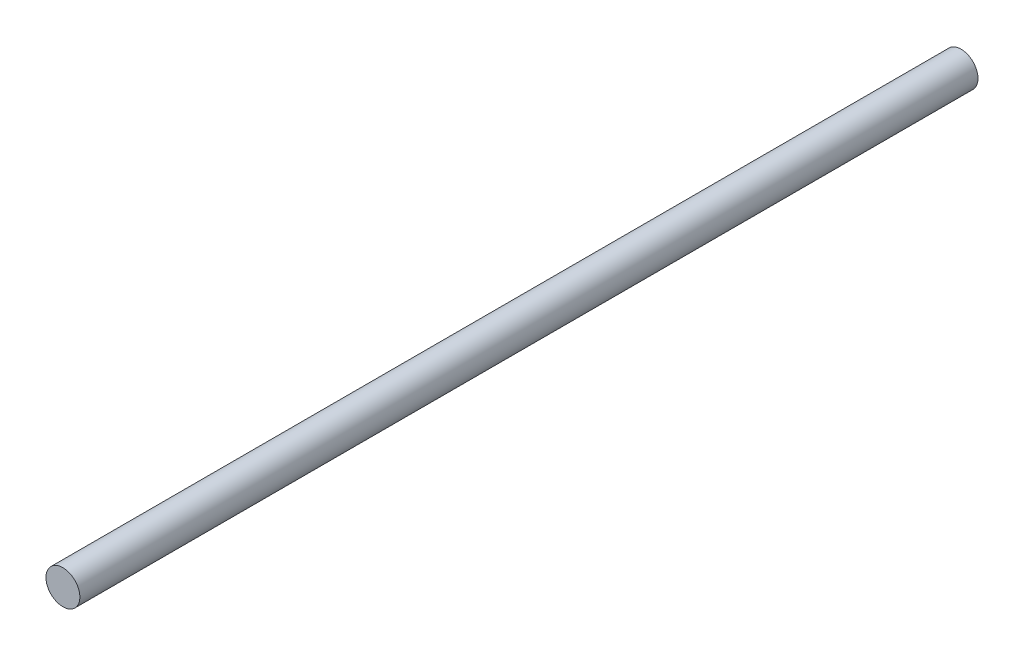
ISO-10303-21;
HEADER;
FILE_DESCRIPTION(('STEP AP214'),'2;1');
FILE_NAME('part.step','',(''),(''),'','','');
FILE_SCHEMA(('AUTOMOTIVE_DESIGN { 1 0 10303 214 1 1 1 1 }'));
ENDSEC;
DATA;
#1=APPLICATION_CONTEXT('core data for automotive mechanical design processes');
#2=APPLICATION_PROTOCOL_DEFINITION('international standard','automotive_design',2000,#1);
#3=PRODUCT_CONTEXT('',#1,'mechanical');
#4=PRODUCT('Part','Part','',(#3));
#5=PRODUCT_RELATED_PRODUCT_CATEGORY('part','',(#4));
#6=PRODUCT_DEFINITION_FORMATION('','',#4);
#7=PRODUCT_DEFINITION_CONTEXT('part definition',#1,'design');
#8=PRODUCT_DEFINITION('design','',#6,#7);
#9=PRODUCT_DEFINITION_SHAPE('','',#8);
#10=(LENGTH_UNIT() NAMED_UNIT(*) SI_UNIT(.MILLI.,.METRE.));
#11=(NAMED_UNIT(*) PLANE_ANGLE_UNIT() SI_UNIT($,.RADIAN.));
#12=(NAMED_UNIT(*) SI_UNIT($,.STERADIAN.) SOLID_ANGLE_UNIT());
#13=UNCERTAINTY_MEASURE_WITH_UNIT(LENGTH_MEASURE(1.E-05),#10,'distance_accuracy_value','');
#14=(GEOMETRIC_REPRESENTATION_CONTEXT(3) GLOBAL_UNCERTAINTY_ASSIGNED_CONTEXT((#13)) GLOBAL_UNIT_ASSIGNED_CONTEXT((#10,
#11,#12)) REPRESENTATION_CONTEXT('',''));
#15=CARTESIAN_POINT('',(0.,0.,0.));
#16=DIRECTION('',(0.,0.,1.));
#17=DIRECTION('',(1.,0.,0.));
#18=AXIS2_PLACEMENT_3D('',#15,#16,#17);
#19=CARTESIAN_POINT('',(-142.875,0.,84.1375));
#20=DIRECTION('',(0.,0.,-1.));
#21=DIRECTION('',(-1.,0.,0.));
#22=AXIS2_PLACEMENT_3D('',#19,#20,#21);
#23=CYLINDRICAL_SURFACE('',#22,3.175);
#24=CARTESIAN_POINT('',(-142.875,0.,84.1375));
#25=DIRECTION('',(0.,0.,1.));
#26=DIRECTION('',(1.,0.,0.));
#27=AXIS2_PLACEMENT_3D('',#24,#25,#26);
#28=CIRCLE('',#27,3.175);
#29=CARTESIAN_POINT('',(-139.7,0.,84.1375));
#30=VERTEX_POINT('',#29);
#31=EDGE_CURVE('E10',#30,#30,#28,.T.);
#32=ORIENTED_EDGE('',*,*,#31,.F.);
#33=EDGE_LOOP('',(#32));
#34=FACE_BOUND('',#33,.T.);
#35=CARTESIAN_POINT('',(-142.875,0.,-84.1375));
#36=DIRECTION('',(0.,0.,1.));
#37=DIRECTION('',(1.,0.,0.));
#38=AXIS2_PLACEMENT_3D('',#35,#36,#37);
#39=CIRCLE('',#38,3.175);
#40=CARTESIAN_POINT('',(-139.7,0.,-84.1375));
#41=VERTEX_POINT('',#40);
#42=EDGE_CURVE('E37',#41,#41,#39,.T.);
#43=ORIENTED_EDGE('',*,*,#42,.T.);
#44=EDGE_LOOP('',(#43));
#45=FACE_BOUND('',#44,.T.);
#46=ADVANCED_FACE('F34',(#34,#45),#23,.T.);
#47=CARTESIAN_POINT('',(-142.875,0.,84.1375));
#48=DIRECTION('',(0.,0.,1.));
#49=DIRECTION('',(1.,0.,0.));
#50=AXIS2_PLACEMENT_3D('',#47,#48,#49);
#51=PLANE('',#50);
#52=ORIENTED_EDGE('',*,*,#31,.T.);
#53=EDGE_LOOP('',(#52));
#54=FACE_BOUND('',#53,.T.);
#55=ADVANCED_FACE('F49',(#54),#51,.T.);
#56=CARTESIAN_POINT('',(-142.875,0.,-84.1375));
#57=DIRECTION('',(0.,0.,1.));
#58=DIRECTION('',(1.,0.,0.));
#59=AXIS2_PLACEMENT_3D('',#56,#57,#58);
#60=PLANE('',#59);
#61=ORIENTED_EDGE('',*,*,#42,.F.);
#62=EDGE_LOOP('',(#61));
#63=FACE_BOUND('',#62,.T.);
#64=ADVANCED_FACE('F47',(#63),#60,.F.);
#65=CLOSED_SHELL('',(#46,#55,#64));
#66=MANIFOLD_SOLID_BREP('B2',#65);
#67=ADVANCED_BREP_SHAPE_REPRESENTATION('',(#18,#66),#14);
#68=SHAPE_DEFINITION_REPRESENTATION(#9,#67);
ENDSEC;
END-ISO-10303-21;
